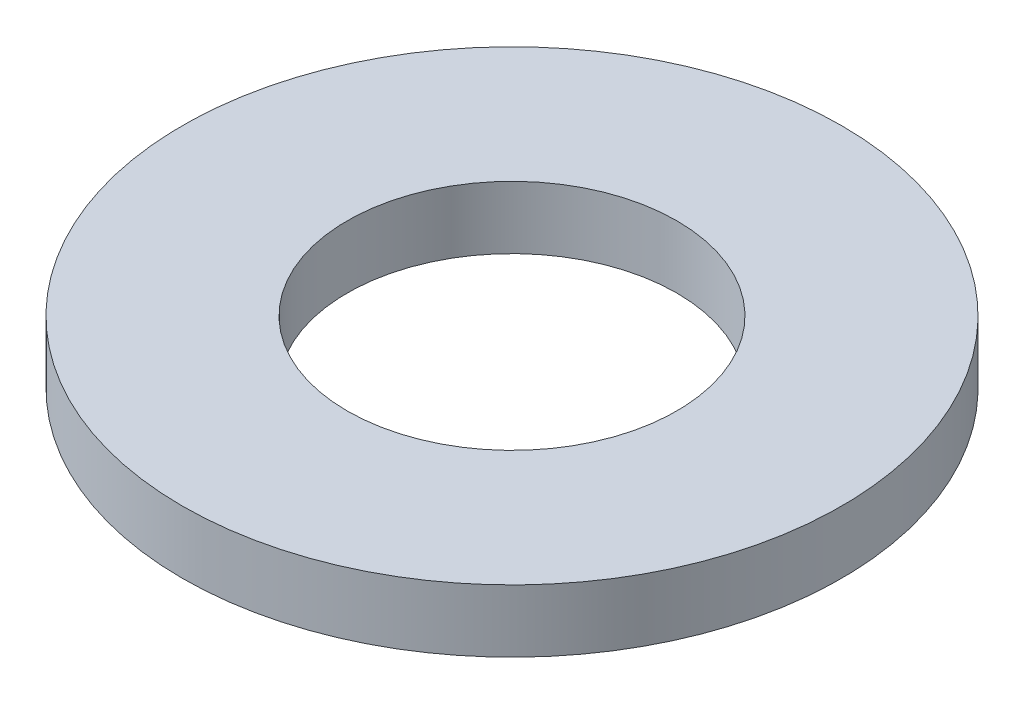
ISO-10303-21;
HEADER;
FILE_DESCRIPTION(('STEP AP214'),'2;1');
FILE_NAME('part.step','',(''),(''),'','','');
FILE_SCHEMA(('AUTOMOTIVE_DESIGN { 1 0 10303 214 1 1 1 1 }'));
ENDSEC;
DATA;
#1=APPLICATION_CONTEXT('core data for automotive mechanical design processes');
#2=APPLICATION_PROTOCOL_DEFINITION('international standard','automotive_design',2000,#1);
#3=PRODUCT_CONTEXT('',#1,'mechanical');
#4=PRODUCT('Part','Part','',(#3));
#5=PRODUCT_RELATED_PRODUCT_CATEGORY('part','',(#4));
#6=PRODUCT_DEFINITION_FORMATION('','',#4);
#7=PRODUCT_DEFINITION_CONTEXT('part definition',#1,'design');
#8=PRODUCT_DEFINITION('design','',#6,#7);
#9=PRODUCT_DEFINITION_SHAPE('','',#8);
#10=(LENGTH_UNIT() NAMED_UNIT(*) SI_UNIT(.MILLI.,.METRE.));
#11=(NAMED_UNIT(*) PLANE_ANGLE_UNIT() SI_UNIT($,.RADIAN.));
#12=(NAMED_UNIT(*) SI_UNIT($,.STERADIAN.) SOLID_ANGLE_UNIT());
#13=UNCERTAINTY_MEASURE_WITH_UNIT(LENGTH_MEASURE(1.E-05),#10,'distance_accuracy_value','');
#14=(GEOMETRIC_REPRESENTATION_CONTEXT(3) GLOBAL_UNCERTAINTY_ASSIGNED_CONTEXT((#13)) GLOBAL_UNIT_ASSIGNED_CONTEXT((#10,
#11,#12)) REPRESENTATION_CONTEXT('',''));
#15=CARTESIAN_POINT('',(0.,0.,0.));
#16=DIRECTION('',(0.,0.,1.));
#17=DIRECTION('',(1.,0.,0.));
#18=AXIS2_PLACEMENT_3D('',#15,#16,#17);
#19=CARTESIAN_POINT('',(0.,1.14,0.));
#20=DIRECTION('',(0.,1.,0.));
#21=DIRECTION('',(0.,0.,1.));
#22=AXIS2_PLACEMENT_3D('',#19,#20,#21);
#23=PLANE('',#22);
#24=CARTESIAN_POINT('',(0.,1.14,0.));
#25=DIRECTION('',(0.,1.,0.));
#26=DIRECTION('',(0.,0.,1.));
#27=AXIS2_PLACEMENT_3D('',#24,#25,#26);
#28=CIRCLE('',#27,6.);
#29=CARTESIAN_POINT('',(0.,1.14,6.));
#30=VERTEX_POINT('',#29);
#31=EDGE_CURVE('E10',#30,#30,#28,.T.);
#32=ORIENTED_EDGE('',*,*,#31,.T.);
#33=EDGE_LOOP('',(#32));
#34=FACE_BOUND('',#33,.T.);
#35=CARTESIAN_POINT('',(0.,1.14,0.));
#36=DIRECTION('',(0.,1.,0.));
#37=DIRECTION('',(0.,0.,1.));
#38=AXIS2_PLACEMENT_3D('',#35,#36,#37);
#39=CIRCLE('',#38,3.);
#40=CARTESIAN_POINT('',(0.,1.14,3.));
#41=VERTEX_POINT('',#40);
#42=EDGE_CURVE('E43',#41,#41,#39,.T.);
#43=ORIENTED_EDGE('',*,*,#42,.F.);
#44=EDGE_LOOP('',(#43));
#45=FACE_BOUND('',#44,.T.);
#46=ADVANCED_FACE('F32',(#34,#45),#23,.T.);
#47=CARTESIAN_POINT('',(0.,0.,0.));
#48=DIRECTION('',(0.,1.,0.));
#49=DIRECTION('',(0.,0.,1.));
#50=AXIS2_PLACEMENT_3D('',#47,#48,#49);
#51=PLANE('',#50);
#52=CARTESIAN_POINT('',(0.,0.,0.));
#53=DIRECTION('',(0.,1.,0.));
#54=DIRECTION('',(0.,0.,1.));
#55=AXIS2_PLACEMENT_3D('',#52,#53,#54);
#56=CIRCLE('',#55,6.);
#57=CARTESIAN_POINT('',(0.,0.,6.));
#58=VERTEX_POINT('',#57);
#59=EDGE_CURVE('E36',#58,#58,#56,.T.);
#60=ORIENTED_EDGE('',*,*,#59,.F.);
#61=EDGE_LOOP('',(#60));
#62=FACE_BOUND('',#61,.T.);
#63=CARTESIAN_POINT('',(0.,0.,0.));
#64=DIRECTION('',(0.,1.,0.));
#65=DIRECTION('',(0.,0.,1.));
#66=AXIS2_PLACEMENT_3D('',#63,#64,#65);
#67=CIRCLE('',#66,3.);
#68=CARTESIAN_POINT('',(0.,0.,3.));
#69=VERTEX_POINT('',#68);
#70=EDGE_CURVE('E45',#69,#69,#67,.T.);
#71=ORIENTED_EDGE('',*,*,#70,.T.);
#72=EDGE_LOOP('',(#71));
#73=FACE_BOUND('',#72,.T.);
#74=ADVANCED_FACE('F55',(#62,#73),#51,.F.);
#75=CARTESIAN_POINT('',(0.,1.14,0.));
#76=DIRECTION('',(0.,-1.,0.));
#77=DIRECTION('',(0.,0.,-1.));
#78=AXIS2_PLACEMENT_3D('',#75,#76,#77);
#79=CYLINDRICAL_SURFACE('',#78,6.);
#80=ORIENTED_EDGE('',*,*,#31,.F.);
#81=EDGE_LOOP('',(#80));
#82=FACE_BOUND('',#81,.T.);
#83=ORIENTED_EDGE('',*,*,#59,.T.);
#84=EDGE_LOOP('',(#83));
#85=FACE_BOUND('',#84,.T.);
#86=ADVANCED_FACE('F34',(#82,#85),#79,.T.);
#87=CARTESIAN_POINT('',(0.,1.14,0.));
#88=DIRECTION('',(0.,-1.,0.));
#89=DIRECTION('',(0.,0.,-1.));
#90=AXIS2_PLACEMENT_3D('',#87,#88,#89);
#91=CYLINDRICAL_SURFACE('',#90,3.);
#92=ORIENTED_EDGE('',*,*,#42,.T.);
#93=EDGE_LOOP('',(#92));
#94=FACE_BOUND('',#93,.T.);
#95=ORIENTED_EDGE('',*,*,#70,.F.);
#96=EDGE_LOOP('',(#95));
#97=FACE_BOUND('',#96,.T.);
#98=ADVANCED_FACE('F51',(#94,#97),#91,.F.);
#99=CLOSED_SHELL('',(#46,#74,#86,#98));
#100=MANIFOLD_SOLID_BREP('B2',#99);
#101=ADVANCED_BREP_SHAPE_REPRESENTATION('',(#18,#100),#14);
#102=SHAPE_DEFINITION_REPRESENTATION(#9,#101);
ENDSEC;
END-ISO-10303-21;
